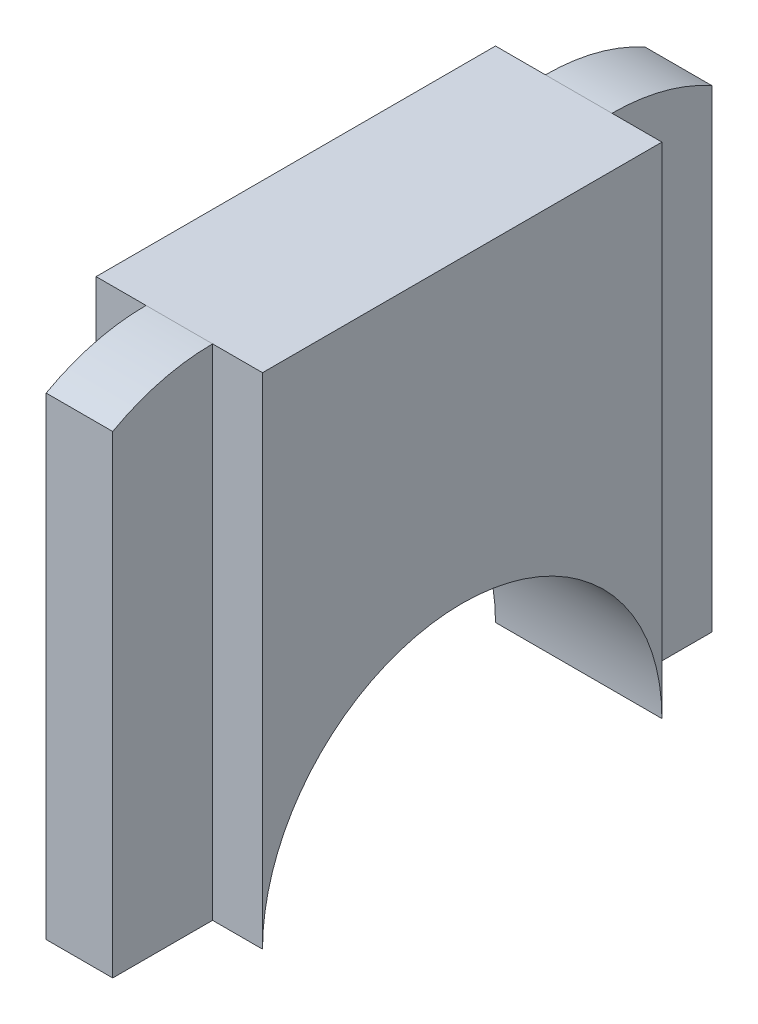
ISO-10303-21;
HEADER;
FILE_DESCRIPTION(('STEP AP214'),'2;1');
FILE_NAME('part.step','',(''),(''),'','','');
FILE_SCHEMA(('AUTOMOTIVE_DESIGN { 1 0 10303 214 1 1 1 1 }'));
ENDSEC;
DATA;
#1=APPLICATION_CONTEXT('core data for automotive mechanical design processes');
#2=APPLICATION_PROTOCOL_DEFINITION('international standard','automotive_design',2000,#1);
#3=PRODUCT_CONTEXT('',#1,'mechanical');
#4=PRODUCT('Part','Part','',(#3));
#5=PRODUCT_RELATED_PRODUCT_CATEGORY('part','',(#4));
#6=PRODUCT_DEFINITION_FORMATION('','',#4);
#7=PRODUCT_DEFINITION_CONTEXT('part definition',#1,'design');
#8=PRODUCT_DEFINITION('design','',#6,#7);
#9=PRODUCT_DEFINITION_SHAPE('','',#8);
#10=(LENGTH_UNIT() NAMED_UNIT(*) SI_UNIT(.MILLI.,.METRE.));
#11=(NAMED_UNIT(*) PLANE_ANGLE_UNIT() SI_UNIT($,.RADIAN.));
#12=(NAMED_UNIT(*) SI_UNIT($,.STERADIAN.) SOLID_ANGLE_UNIT());
#13=UNCERTAINTY_MEASURE_WITH_UNIT(LENGTH_MEASURE(1.E-05),#10,'distance_accuracy_value','');
#14=(GEOMETRIC_REPRESENTATION_CONTEXT(3) GLOBAL_UNCERTAINTY_ASSIGNED_CONTEXT((#13)) GLOBAL_UNIT_ASSIGNED_CONTEXT((#10,
#11,#12)) REPRESENTATION_CONTEXT('',''));
#15=CARTESIAN_POINT('',(0.,0.,0.));
#16=DIRECTION('',(0.,0.,1.));
#17=DIRECTION('',(1.,0.,0.));
#18=AXIS2_PLACEMENT_3D('',#15,#16,#17);
#19=CARTESIAN_POINT('',(-2.5,0.,-6.));
#20=DIRECTION('',(0.,0.,1.));
#21=DIRECTION('',(0.,-1.,0.));
#22=AXIS2_PLACEMENT_3D('',#19,#20,#21);
#23=PLANE('',#22);
#24=DIRECTION('',(0.,-1.,0.));
#25=VECTOR('',#24,1.);
#26=CARTESIAN_POINT('',(-1.,0.,-6.));
#27=LINE('',#26,#25);
#28=CARTESIAN_POINT('',(-1.,15.,-6.));
#29=VERTEX_POINT('',#28);
#30=CARTESIAN_POINT('',(-1.,0.,-6.));
#31=VERTEX_POINT('',#30);
#32=EDGE_CURVE('E274',#29,#31,#27,.T.);
#33=ORIENTED_EDGE('',*,*,#32,.T.);
#34=DIRECTION('',(1.,0.,0.));
#35=VECTOR('',#34,1.);
#36=CARTESIAN_POINT('',(-2.5,0.,-6.));
#37=LINE('',#36,#35);
#38=CARTESIAN_POINT('',(-2.5,0.,-6.));
#39=VERTEX_POINT('',#38);
#40=EDGE_CURVE('E49',#39,#31,#37,.T.);
#41=ORIENTED_EDGE('',*,*,#40,.F.);
#42=DIRECTION('',(0.,-1.,0.));
#43=VECTOR('',#42,1.);
#44=CARTESIAN_POINT('',(-2.5,0.,-6.));
#45=LINE('',#44,#43);
#46=CARTESIAN_POINT('',(-2.5,15.,-6.));
#47=VERTEX_POINT('',#46);
#48=EDGE_CURVE('E241',#47,#39,#45,.T.);
#49=ORIENTED_EDGE('',*,*,#48,.F.);
#50=DIRECTION('',(1.,0.,0.));
#51=VECTOR('',#50,1.);
#52=CARTESIAN_POINT('',(-2.5,15.,-6.));
#53=LINE('',#52,#51);
#54=EDGE_CURVE('E254',#47,#29,#53,.T.);
#55=ORIENTED_EDGE('',*,*,#54,.T.);
#56=EDGE_LOOP('',(#33,#41,#49,#55));
#57=FACE_BOUND('',#56,.T.);
#58=ADVANCED_FACE('F45',(#57),#23,.F.);
#59=CARTESIAN_POINT('',(-2.5,0.,6.));
#60=DIRECTION('',(0.,0.,1.));
#61=DIRECTION('',(0.,-1.,0.));
#62=AXIS2_PLACEMENT_3D('',#59,#60,#61);
#63=PLANE('',#62);
#64=DIRECTION('',(1.,0.,0.));
#65=VECTOR('',#64,1.);
#66=CARTESIAN_POINT('',(-2.5,0.,6.));
#67=LINE('',#66,#65);
#68=CARTESIAN_POINT('',(-2.5,0.,6.));
#69=VERTEX_POINT('',#68);
#70=CARTESIAN_POINT('',(-1.,0.,6.));
#71=VERTEX_POINT('',#70);
#72=EDGE_CURVE('E11',#69,#71,#67,.T.);
#73=ORIENTED_EDGE('',*,*,#72,.T.);
#74=DIRECTION('',(0.,-1.,0.));
#75=VECTOR('',#74,1.);
#76=CARTESIAN_POINT('',(-1.,0.,6.));
#77=LINE('',#76,#75);
#78=CARTESIAN_POINT('',(-1.,15.,6.));
#79=VERTEX_POINT('',#78);
#80=EDGE_CURVE('E197',#79,#71,#77,.T.);
#81=ORIENTED_EDGE('',*,*,#80,.F.);
#82=DIRECTION('',(1.,0.,0.));
#83=VECTOR('',#82,1.);
#84=CARTESIAN_POINT('',(-2.5,15.,6.));
#85=LINE('',#84,#83);
#86=CARTESIAN_POINT('',(-2.5,15.,6.));
#87=VERTEX_POINT('',#86);
#88=EDGE_CURVE('E250',#87,#79,#85,.T.);
#89=ORIENTED_EDGE('',*,*,#88,.F.);
#90=DIRECTION('',(0.,-1.,0.));
#91=VECTOR('',#90,1.);
#92=CARTESIAN_POINT('',(-2.5,0.,6.));
#93=LINE('',#92,#91);
#94=EDGE_CURVE('E169',#87,#69,#93,.T.);
#95=ORIENTED_EDGE('',*,*,#94,.T.);
#96=EDGE_LOOP('',(#73,#81,#89,#95));
#97=FACE_BOUND('',#96,.T.);
#98=ADVANCED_FACE('F297',(#97),#63,.T.);
#99=CARTESIAN_POINT('',(-2.5,0.,0.));
#100=DIRECTION('',(1.,0.,0.));
#101=DIRECTION('',(0.,0.,-1.));
#102=AXIS2_PLACEMENT_3D('',#99,#100,#101);
#103=CYLINDRICAL_SURFACE('',#102,6.);
#104=ORIENTED_EDGE('',*,*,#40,.T.);
#105=DIRECTION('',(1.,0.,0.));
#106=VECTOR('',#105,1.);
#107=CARTESIAN_POINT('',(-1.,0.,-6.));
#108=LINE('',#107,#106);
#109=CARTESIAN_POINT('',(1.,0.,-6.));
#110=VERTEX_POINT('',#109);
#111=EDGE_CURVE('E153',#31,#110,#108,.T.);
#112=ORIENTED_EDGE('',*,*,#111,.T.);
#113=CARTESIAN_POINT('',(2.5,0.,-6.));
#114=VERTEX_POINT('',#113);
#115=EDGE_CURVE('E161',#110,#114,#37,.T.);
#116=ORIENTED_EDGE('',*,*,#115,.T.);
#117=CARTESIAN_POINT('',(2.5,0.,0.));
#118=DIRECTION('',(1.,0.,0.));
#119=DIRECTION('',(0.,0.,-1.));
#120=AXIS2_PLACEMENT_3D('',#117,#118,#119);
#121=CIRCLE('',#120,6.);
#122=CARTESIAN_POINT('',(2.5,0.,6.));
#123=VERTEX_POINT('',#122);
#124=EDGE_CURVE('E216',#123,#114,#121,.F.);
#125=ORIENTED_EDGE('',*,*,#124,.F.);
#126=CARTESIAN_POINT('',(1.,0.,6.));
#127=VERTEX_POINT('',#126);
#128=EDGE_CURVE('E55',#127,#123,#67,.T.);
#129=ORIENTED_EDGE('',*,*,#128,.F.);
#130=DIRECTION('',(1.,0.,0.));
#131=VECTOR('',#130,1.);
#132=CARTESIAN_POINT('',(-1.,0.,6.));
#133=LINE('',#132,#131);
#134=EDGE_CURVE('E213',#71,#127,#133,.T.);
#135=ORIENTED_EDGE('',*,*,#134,.F.);
#136=ORIENTED_EDGE('',*,*,#72,.F.);
#137=CARTESIAN_POINT('',(-2.5,0.,0.));
#138=DIRECTION('',(1.,0.,0.));
#139=DIRECTION('',(0.,0.,-1.));
#140=AXIS2_PLACEMENT_3D('',#137,#138,#139);
#141=CIRCLE('',#140,6.);
#142=EDGE_CURVE('E238',#69,#39,#141,.F.);
#143=ORIENTED_EDGE('',*,*,#142,.T.);
#144=EDGE_LOOP('',(#104,#112,#116,#125,#129,#135,#136,#143));
#145=FACE_BOUND('',#144,.T.);
#146=ADVANCED_FACE('F47',(#145),#103,.F.);
#147=DIRECTION('',(0.,-1.,0.));
#148=VECTOR('',#147,1.);
#149=CARTESIAN_POINT('',(1.,0.,6.));
#150=LINE('',#149,#148);
#151=CARTESIAN_POINT('',(1.,15.,6.));
#152=VERTEX_POINT('',#151);
#153=EDGE_CURVE('E71',#152,#127,#150,.T.);
#154=ORIENTED_EDGE('',*,*,#153,.T.);
#155=ORIENTED_EDGE('',*,*,#128,.T.);
#156=DIRECTION('',(0.,-1.,0.));
#157=VECTOR('',#156,1.);
#158=CARTESIAN_POINT('',(2.5,0.,6.));
#159=LINE('',#158,#157);
#160=CARTESIAN_POINT('',(2.5,15.,6.));
#161=VERTEX_POINT('',#160);
#162=EDGE_CURVE('E234',#161,#123,#159,.T.);
#163=ORIENTED_EDGE('',*,*,#162,.F.);
#164=EDGE_CURVE('E253',#152,#161,#85,.T.);
#165=ORIENTED_EDGE('',*,*,#164,.F.);
#166=EDGE_LOOP('',(#154,#155,#163,#165));
#167=FACE_BOUND('',#166,.T.);
#168=ADVANCED_FACE('F310',(#167),#63,.T.);
#169=CARTESIAN_POINT('',(-2.5,15.,0.));
#170=DIRECTION('',(0.,-1.,0.));
#171=DIRECTION('',(0.,0.,-1.));
#172=AXIS2_PLACEMENT_3D('',#169,#170,#171);
#173=PLANE('',#172);
#174=ORIENTED_EDGE('',*,*,#88,.T.);
#175=DIRECTION('',(1.,0.,0.));
#176=VECTOR('',#175,1.);
#177=CARTESIAN_POINT('',(-1.,15.,6.));
#178=LINE('',#177,#176);
#179=EDGE_CURVE('E212',#79,#152,#178,.T.);
#180=ORIENTED_EDGE('',*,*,#179,.T.);
#181=ORIENTED_EDGE('',*,*,#164,.T.);
#182=DIRECTION('',(0.,0.,-1.));
#183=VECTOR('',#182,1.);
#184=CARTESIAN_POINT('',(2.5,15.,0.));
#185=LINE('',#184,#183);
#186=CARTESIAN_POINT('',(2.5,15.,-6.));
#187=VERTEX_POINT('',#186);
#188=EDGE_CURVE('E230',#161,#187,#185,.T.);
#189=ORIENTED_EDGE('',*,*,#188,.T.);
#190=CARTESIAN_POINT('',(1.,15.,-6.));
#191=VERTEX_POINT('',#190);
#192=EDGE_CURVE('E257',#191,#187,#53,.T.);
#193=ORIENTED_EDGE('',*,*,#192,.F.);
#194=DIRECTION('',(1.,0.,0.));
#195=VECTOR('',#194,1.);
#196=CARTESIAN_POINT('',(-1.,15.,-6.));
#197=LINE('',#196,#195);
#198=EDGE_CURVE('E174',#29,#191,#197,.T.);
#199=ORIENTED_EDGE('',*,*,#198,.F.);
#200=ORIENTED_EDGE('',*,*,#54,.F.);
#201=DIRECTION('',(0.,0.,-1.));
#202=VECTOR('',#201,1.);
#203=CARTESIAN_POINT('',(-2.5,15.,0.));
#204=LINE('',#203,#202);
#205=EDGE_CURVE('E244',#87,#47,#204,.T.);
#206=ORIENTED_EDGE('',*,*,#205,.F.);
#207=EDGE_LOOP('',(#174,#180,#181,#189,#193,#199,#200,#206));
#208=FACE_BOUND('',#207,.T.);
#209=ADVANCED_FACE('F301',(#208),#173,.F.);
#210=ORIENTED_EDGE('',*,*,#115,.F.);
#211=DIRECTION('',(0.,-1.,0.));
#212=VECTOR('',#211,1.);
#213=CARTESIAN_POINT('',(1.,0.,-6.));
#214=LINE('',#213,#212);
#215=EDGE_CURVE('E139',#191,#110,#214,.T.);
#216=ORIENTED_EDGE('',*,*,#215,.F.);
#217=ORIENTED_EDGE('',*,*,#192,.T.);
#218=DIRECTION('',(0.,-1.,0.));
#219=VECTOR('',#218,1.);
#220=CARTESIAN_POINT('',(2.5,0.,-6.));
#221=LINE('',#220,#219);
#222=EDGE_CURVE('E164',#187,#114,#221,.T.);
#223=ORIENTED_EDGE('',*,*,#222,.T.);
#224=EDGE_LOOP('',(#210,#216,#217,#223));
#225=FACE_BOUND('',#224,.T.);
#226=ADVANCED_FACE('F162',(#225),#23,.F.);
#227=CARTESIAN_POINT('',(-2.5,0.,0.));
#228=DIRECTION('',(1.,0.,0.));
#229=DIRECTION('',(0.,0.,-1.));
#230=AXIS2_PLACEMENT_3D('',#227,#228,#229);
#231=PLANE('',#230);
#232=ORIENTED_EDGE('',*,*,#142,.F.);
#233=ORIENTED_EDGE('',*,*,#94,.F.);
#234=ORIENTED_EDGE('',*,*,#205,.T.);
#235=ORIENTED_EDGE('',*,*,#48,.T.);
#236=EDGE_LOOP('',(#232,#233,#234,#235));
#237=FACE_BOUND('',#236,.T.);
#238=ADVANCED_FACE('F295',(#237),#231,.F.);
#239=CARTESIAN_POINT('',(2.5,0.,0.));
#240=DIRECTION('',(1.,0.,0.));
#241=DIRECTION('',(0.,0.,-1.));
#242=AXIS2_PLACEMENT_3D('',#239,#240,#241);
#243=PLANE('',#242);
#244=ORIENTED_EDGE('',*,*,#124,.T.);
#245=ORIENTED_EDGE('',*,*,#222,.F.);
#246=ORIENTED_EDGE('',*,*,#188,.F.);
#247=ORIENTED_EDGE('',*,*,#162,.T.);
#248=EDGE_LOOP('',(#244,#245,#246,#247));
#249=FACE_BOUND('',#248,.T.);
#250=ADVANCED_FACE('F306',(#249),#243,.T.);
#251=CARTESIAN_POINT('',(-1.,0.,0.));
#252=DIRECTION('',(0.,1.,0.));
#253=DIRECTION('',(0.,0.,1.));
#254=AXIS2_PLACEMENT_3D('',#251,#252,#253);
#255=PLANE('',#254);
#256=ORIENTED_EDGE('',*,*,#134,.T.);
#257=DIRECTION('',(0.,0.,1.));
#258=VECTOR('',#257,1.);
#259=CARTESIAN_POINT('',(1.,0.,0.));
#260=LINE('',#259,#258);
#261=CARTESIAN_POINT('',(1.,0.,9.));
#262=VERTEX_POINT('',#261);
#263=EDGE_CURVE('E193',#127,#262,#260,.T.);
#264=ORIENTED_EDGE('',*,*,#263,.T.);
#265=DIRECTION('',(1.,0.,0.));
#266=VECTOR('',#265,1.);
#267=CARTESIAN_POINT('',(-1.,0.,9.));
#268=LINE('',#267,#266);
#269=CARTESIAN_POINT('',(-1.,0.,9.));
#270=VERTEX_POINT('',#269);
#271=EDGE_CURVE('E217',#270,#262,#268,.T.);
#272=ORIENTED_EDGE('',*,*,#271,.F.);
#273=DIRECTION('',(0.,0.,1.));
#274=VECTOR('',#273,1.);
#275=CARTESIAN_POINT('',(-1.,0.,0.));
#276=LINE('',#275,#274);
#277=EDGE_CURVE('E209',#71,#270,#276,.T.);
#278=ORIENTED_EDGE('',*,*,#277,.F.);
#279=EDGE_LOOP('',(#256,#264,#272,#278));
#280=FACE_BOUND('',#279,.T.);
#281=ADVANCED_FACE('F323',(#280),#255,.F.);
#282=CARTESIAN_POINT('',(-1.,0.,9.));
#283=DIRECTION('',(0.,0.,1.));
#284=DIRECTION('',(0.,-1.,0.));
#285=AXIS2_PLACEMENT_3D('',#282,#283,#284);
#286=PLANE('',#285);
#287=ORIENTED_EDGE('',*,*,#271,.T.);
#288=DIRECTION('',(0.,-1.,0.));
#289=VECTOR('',#288,1.);
#290=CARTESIAN_POINT('',(1.,0.,9.));
#291=LINE('',#290,#289);
#292=CARTESIAN_POINT('',(1.,14.22,9.));
#293=VERTEX_POINT('',#292);
#294=EDGE_CURVE('E189',#293,#262,#291,.T.);
#295=ORIENTED_EDGE('',*,*,#294,.F.);
#296=DIRECTION('',(1.,0.,0.));
#297=VECTOR('',#296,1.);
#298=CARTESIAN_POINT('',(-1.,14.22,9.));
#299=LINE('',#298,#297);
#300=CARTESIAN_POINT('',(-1.,14.22,9.));
#301=VERTEX_POINT('',#300);
#302=EDGE_CURVE('E220',#301,#293,#299,.T.);
#303=ORIENTED_EDGE('',*,*,#302,.F.);
#304=DIRECTION('',(0.,-1.,0.));
#305=VECTOR('',#304,1.);
#306=CARTESIAN_POINT('',(-1.,0.,9.));
#307=LINE('',#306,#305);
#308=EDGE_CURVE('E205',#301,#270,#307,.T.);
#309=ORIENTED_EDGE('',*,*,#308,.T.);
#310=EDGE_LOOP('',(#287,#295,#303,#309));
#311=FACE_BOUND('',#310,.T.);
#312=ADVANCED_FACE('F319',(#311),#286,.T.);
#313=CARTESIAN_POINT('',(-1.,8.84076923076922,6.));
#314=DIRECTION('',(1.,0.,0.));
#315=DIRECTION('',(0.,0.,-1.));
#316=AXIS2_PLACEMENT_3D('',#313,#314,#315);
#317=CYLINDRICAL_SURFACE('',#316,6.15923076923078);
#318=ORIENTED_EDGE('',*,*,#302,.T.);
#319=CARTESIAN_POINT('',(1.,8.84076923076922,6.));
#320=DIRECTION('',(1.,0.,0.));
#321=DIRECTION('',(0.,0.,-1.));
#322=AXIS2_PLACEMENT_3D('',#319,#320,#321);
#323=CIRCLE('',#322,6.15923076923078);
#324=EDGE_CURVE('E186',#152,#293,#323,.T.);
#325=ORIENTED_EDGE('',*,*,#324,.F.);
#326=ORIENTED_EDGE('',*,*,#179,.F.);
#327=CARTESIAN_POINT('',(-1.,8.84076923076922,6.));
#328=DIRECTION('',(1.,0.,0.));
#329=DIRECTION('',(0.,0.,-1.));
#330=AXIS2_PLACEMENT_3D('',#327,#328,#329);
#331=CIRCLE('',#330,6.15923076923078);
#332=EDGE_CURVE('E201',#79,#301,#331,.T.);
#333=ORIENTED_EDGE('',*,*,#332,.T.);
#334=EDGE_LOOP('',(#318,#325,#326,#333));
#335=FACE_BOUND('',#334,.T.);
#336=ADVANCED_FACE('F313',(#335),#317,.T.);
#337=CARTESIAN_POINT('',(-1.,0.,0.));
#338=DIRECTION('',(1.,0.,0.));
#339=DIRECTION('',(0.,0.,-1.));
#340=AXIS2_PLACEMENT_3D('',#337,#338,#339);
#341=PLANE('',#340);
#342=ORIENTED_EDGE('',*,*,#80,.T.);
#343=ORIENTED_EDGE('',*,*,#277,.T.);
#344=ORIENTED_EDGE('',*,*,#308,.F.);
#345=ORIENTED_EDGE('',*,*,#332,.F.);
#346=EDGE_LOOP('',(#342,#343,#344,#345));
#347=FACE_BOUND('',#346,.T.);
#348=ADVANCED_FACE('F316',(#347),#341,.F.);
#349=CARTESIAN_POINT('',(1.,0.,0.));
#350=DIRECTION('',(1.,0.,0.));
#351=DIRECTION('',(0.,0.,-1.));
#352=AXIS2_PLACEMENT_3D('',#349,#350,#351);
#353=PLANE('',#352);
#354=ORIENTED_EDGE('',*,*,#153,.F.);
#355=ORIENTED_EDGE('',*,*,#324,.T.);
#356=ORIENTED_EDGE('',*,*,#294,.T.);
#357=ORIENTED_EDGE('',*,*,#263,.F.);
#358=EDGE_LOOP('',(#354,#355,#356,#357));
#359=FACE_BOUND('',#358,.T.);
#360=ADVANCED_FACE('F321',(#359),#353,.T.);
#361=CARTESIAN_POINT('',(-1.,8.84076923076922,-6.));
#362=DIRECTION('',(1.,0.,0.));
#363=DIRECTION('',(0.,0.,-1.));
#364=AXIS2_PLACEMENT_3D('',#361,#362,#363);
#365=CYLINDRICAL_SURFACE('',#364,6.15923076923078);
#366=ORIENTED_EDGE('',*,*,#198,.T.);
#367=CARTESIAN_POINT('',(1.,8.84076923076922,-6.));
#368=DIRECTION('',(1.,0.,0.));
#369=DIRECTION('',(0.,0.,-1.));
#370=AXIS2_PLACEMENT_3D('',#367,#368,#369);
#371=CIRCLE('',#370,6.15923076923078);
#372=CARTESIAN_POINT('',(1.,14.22,-9.));
#373=VERTEX_POINT('',#372);
#374=EDGE_CURVE('E63',#191,#373,#371,.F.);
#375=ORIENTED_EDGE('',*,*,#374,.T.);
#376=DIRECTION('',(1.,0.,0.));
#377=VECTOR('',#376,1.);
#378=CARTESIAN_POINT('',(-1.,14.22,-9.));
#379=LINE('',#378,#377);
#380=CARTESIAN_POINT('',(-1.,14.22,-9.));
#381=VERTEX_POINT('',#380);
#382=EDGE_CURVE('E178',#381,#373,#379,.T.);
#383=ORIENTED_EDGE('',*,*,#382,.F.);
#384=CARTESIAN_POINT('',(-1.,8.84076923076922,-6.));
#385=DIRECTION('',(1.,0.,0.));
#386=DIRECTION('',(0.,0.,-1.));
#387=AXIS2_PLACEMENT_3D('',#384,#385,#386);
#388=CIRCLE('',#387,6.15923076923078);
#389=EDGE_CURVE('E277',#29,#381,#388,.F.);
#390=ORIENTED_EDGE('',*,*,#389,.F.);
#391=EDGE_LOOP('',(#366,#375,#383,#390));
#392=FACE_BOUND('',#391,.T.);
#393=ADVANCED_FACE('F285',(#392),#365,.T.);
#394=CARTESIAN_POINT('',(-1.,0.,-9.));
#395=DIRECTION('',(0.,0.,1.));
#396=DIRECTION('',(0.,-1.,0.));
#397=AXIS2_PLACEMENT_3D('',#394,#395,#396);
#398=PLANE('',#397);
#399=ORIENTED_EDGE('',*,*,#382,.T.);
#400=DIRECTION('',(0.,-1.,0.));
#401=VECTOR('',#400,1.);
#402=CARTESIAN_POINT('',(1.,0.,-9.));
#403=LINE('',#402,#401);
#404=CARTESIAN_POINT('',(1.,0.,-9.));
#405=VERTEX_POINT('',#404);
#406=EDGE_CURVE('E158',#373,#405,#403,.T.);
#407=ORIENTED_EDGE('',*,*,#406,.T.);
#408=DIRECTION('',(1.,0.,0.));
#409=VECTOR('',#408,1.);
#410=CARTESIAN_POINT('',(-1.,0.,-9.));
#411=LINE('',#410,#409);
#412=CARTESIAN_POINT('',(-1.,0.,-9.));
#413=VERTEX_POINT('',#412);
#414=EDGE_CURVE('E156',#413,#405,#411,.T.);
#415=ORIENTED_EDGE('',*,*,#414,.F.);
#416=DIRECTION('',(0.,-1.,0.));
#417=VECTOR('',#416,1.);
#418=CARTESIAN_POINT('',(-1.,0.,-9.));
#419=LINE('',#418,#417);
#420=EDGE_CURVE('E180',#381,#413,#419,.T.);
#421=ORIENTED_EDGE('',*,*,#420,.F.);
#422=EDGE_LOOP('',(#399,#407,#415,#421));
#423=FACE_BOUND('',#422,.T.);
#424=ADVANCED_FACE('F287',(#423),#398,.F.);
#425=CARTESIAN_POINT('',(-1.,0.,0.));
#426=DIRECTION('',(0.,-1.,0.));
#427=DIRECTION('',(0.,0.,-1.));
#428=AXIS2_PLACEMENT_3D('',#425,#426,#427);
#429=PLANE('',#428);
#430=ORIENTED_EDGE('',*,*,#414,.T.);
#431=DIRECTION('',(0.,0.,-1.));
#432=VECTOR('',#431,1.);
#433=CARTESIAN_POINT('',(1.,0.,0.));
#434=LINE('',#433,#432);
#435=EDGE_CURVE('E142',#110,#405,#434,.T.);
#436=ORIENTED_EDGE('',*,*,#435,.F.);
#437=ORIENTED_EDGE('',*,*,#111,.F.);
#438=DIRECTION('',(0.,0.,-1.));
#439=VECTOR('',#438,1.);
#440=CARTESIAN_POINT('',(-1.,0.,0.));
#441=LINE('',#440,#439);
#442=EDGE_CURVE('E271',#31,#413,#441,.T.);
#443=ORIENTED_EDGE('',*,*,#442,.T.);
#444=EDGE_LOOP('',(#430,#436,#437,#443));
#445=FACE_BOUND('',#444,.T.);
#446=ADVANCED_FACE('F150',(#445),#429,.T.);
#447=CARTESIAN_POINT('',(-1.,0.,0.));
#448=DIRECTION('',(1.,0.,0.));
#449=DIRECTION('',(0.,0.,-1.));
#450=AXIS2_PLACEMENT_3D('',#447,#448,#449);
#451=PLANE('',#450);
#452=ORIENTED_EDGE('',*,*,#389,.T.);
#453=ORIENTED_EDGE('',*,*,#420,.T.);
#454=ORIENTED_EDGE('',*,*,#442,.F.);
#455=ORIENTED_EDGE('',*,*,#32,.F.);
#456=EDGE_LOOP('',(#452,#453,#454,#455));
#457=FACE_BOUND('',#456,.T.);
#458=ADVANCED_FACE('F290',(#457),#451,.F.);
#459=CARTESIAN_POINT('',(1.,0.,0.));
#460=DIRECTION('',(1.,0.,0.));
#461=DIRECTION('',(0.,0.,-1.));
#462=AXIS2_PLACEMENT_3D('',#459,#460,#461);
#463=PLANE('',#462);
#464=ORIENTED_EDGE('',*,*,#374,.F.);
#465=ORIENTED_EDGE('',*,*,#215,.T.);
#466=ORIENTED_EDGE('',*,*,#435,.T.);
#467=ORIENTED_EDGE('',*,*,#406,.F.);
#468=EDGE_LOOP('',(#464,#465,#466,#467));
#469=FACE_BOUND('',#468,.T.);
#470=ADVANCED_FACE('F141',(#469),#463,.T.);
#471=CLOSED_SHELL('',(#58,#98,#146,#168,#209,#226,#238,#250,#281,#312,#336,#348,#360,#393,#424,
#446,#458,#470));
#472=MANIFOLD_SOLID_BREP('B2',#471);
#473=ADVANCED_BREP_SHAPE_REPRESENTATION('',(#18,#472),#14);
#474=SHAPE_DEFINITION_REPRESENTATION(#9,#473);
ENDSEC;
END-ISO-10303-21;
